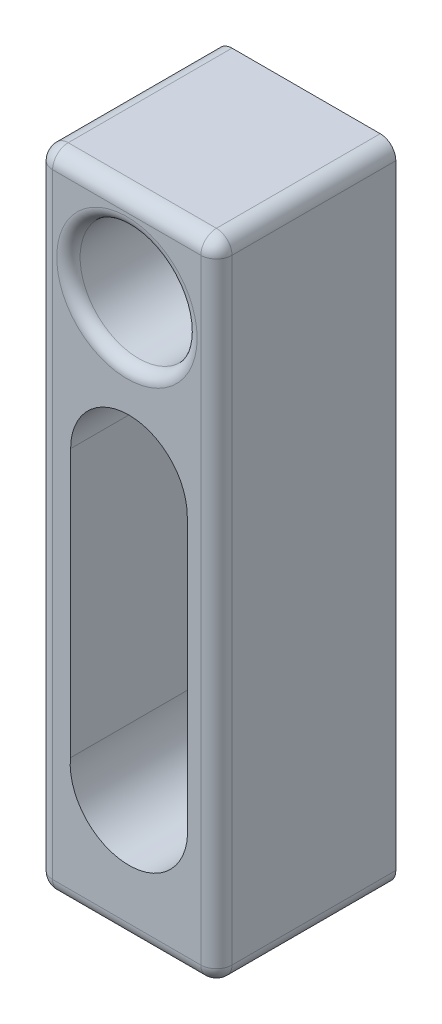
ISO-10303-21;
HEADER;
FILE_DESCRIPTION(('STEP AP214'),'2;1');
FILE_NAME('part.step','',(''),(''),'','','');
FILE_SCHEMA(('AUTOMOTIVE_DESIGN { 1 0 10303 214 1 1 1 1 }'));
ENDSEC;
DATA;
#1=APPLICATION_CONTEXT('core data for automotive mechanical design processes');
#2=APPLICATION_PROTOCOL_DEFINITION('international standard','automotive_design',2000,#1);
#3=PRODUCT_CONTEXT('',#1,'mechanical');
#4=PRODUCT('Part','Part','',(#3));
#5=PRODUCT_RELATED_PRODUCT_CATEGORY('part','',(#4));
#6=PRODUCT_DEFINITION_FORMATION('','',#4);
#7=PRODUCT_DEFINITION_CONTEXT('part definition',#1,'design');
#8=PRODUCT_DEFINITION('design','',#6,#7);
#9=PRODUCT_DEFINITION_SHAPE('','',#8);
#10=(LENGTH_UNIT() NAMED_UNIT(*) SI_UNIT(.MILLI.,.METRE.));
#11=(NAMED_UNIT(*) PLANE_ANGLE_UNIT() SI_UNIT($,.RADIAN.));
#12=(NAMED_UNIT(*) SI_UNIT($,.STERADIAN.) SOLID_ANGLE_UNIT());
#13=UNCERTAINTY_MEASURE_WITH_UNIT(LENGTH_MEASURE(1.E-05),#10,'distance_accuracy_value','');
#14=(GEOMETRIC_REPRESENTATION_CONTEXT(3) GLOBAL_UNCERTAINTY_ASSIGNED_CONTEXT((#13)) GLOBAL_UNIT_ASSIGNED_CONTEXT((#10,
#11,#12)) REPRESENTATION_CONTEXT('',''));
#15=CARTESIAN_POINT('',(0.,0.,0.));
#16=DIRECTION('',(0.,0.,1.));
#17=DIRECTION('',(1.,0.,0.));
#18=AXIS2_PLACEMENT_3D('',#15,#16,#17);
#19=CARTESIAN_POINT('',(0.,0.,2.3));
#20=DIRECTION('',(1.,0.,0.));
#21=DIRECTION('',(0.,1.,0.));
#22=AXIS2_PLACEMENT_3D('',#19,#20,#21);
#23=PLANE('',#22);
#24=DIRECTION('',(0.,-1.,0.));
#25=VECTOR('',#24,1.);
#26=CARTESIAN_POINT('',(0.,0.,0.));
#27=LINE('',#26,#25);
#28=CARTESIAN_POINT('',(0.,-0.2,0.));
#29=VERTEX_POINT('',#28);
#30=CARTESIAN_POINT('',(0.,-8.08,0.));
#31=VERTEX_POINT('',#30);
#32=EDGE_CURVE('E220',#29,#31,#27,.T.);
#33=ORIENTED_EDGE('',*,*,#32,.T.);
#34=DIRECTION('',(0.,0.,-1.));
#35=VECTOR('',#34,1.);
#36=CARTESIAN_POINT('',(0.,-8.08,2.3));
#37=LINE('',#36,#35);
#38=CARTESIAN_POINT('',(0.,-8.08,2.1));
#39=VERTEX_POINT('',#38);
#40=EDGE_CURVE('E317',#31,#39,#37,.F.);
#41=ORIENTED_EDGE('',*,*,#40,.T.);
#42=DIRECTION('',(0.,-1.,0.));
#43=VECTOR('',#42,1.);
#44=CARTESIAN_POINT('',(0.,-0.2,2.1));
#45=LINE('',#44,#43);
#46=CARTESIAN_POINT('',(0.,-0.2,2.1));
#47=VERTEX_POINT('',#46);
#48=EDGE_CURVE('E265',#39,#47,#45,.F.);
#49=ORIENTED_EDGE('',*,*,#48,.T.);
#50=DIRECTION('',(0.,0.,-1.));
#51=VECTOR('',#50,1.);
#52=CARTESIAN_POINT('',(0.,-0.2,2.3));
#53=LINE('',#52,#51);
#54=EDGE_CURVE('E276',#47,#29,#53,.T.);
#55=ORIENTED_EDGE('',*,*,#54,.T.);
#56=EDGE_LOOP('',(#33,#41,#49,#55));
#57=FACE_BOUND('',#56,.T.);
#58=ADVANCED_FACE('F41',(#57),#23,.F.);
#59=CARTESIAN_POINT('',(0.,-8.28,2.3));
#60=DIRECTION('',(0.,1.,0.));
#61=DIRECTION('',(0.,0.,1.));
#62=AXIS2_PLACEMENT_3D('',#59,#60,#61);
#63=PLANE('',#62);
#64=DIRECTION('',(1.,0.,0.));
#65=VECTOR('',#64,1.);
#66=CARTESIAN_POINT('',(0.200000000000001,-8.28,2.1));
#67=LINE('',#66,#65);
#68=CARTESIAN_POINT('',(2.1,-8.28,2.1));
#69=VERTEX_POINT('',#68);
#70=CARTESIAN_POINT('',(0.200000000000001,-8.28,2.1));
#71=VERTEX_POINT('',#70);
#72=EDGE_CURVE('E293',#69,#71,#67,.F.);
#73=ORIENTED_EDGE('',*,*,#72,.T.);
#74=DIRECTION('',(0.,0.,-1.));
#75=VECTOR('',#74,1.);
#76=CARTESIAN_POINT('',(0.200000000000001,-8.28,2.3));
#77=LINE('',#76,#75);
#78=CARTESIAN_POINT('',(0.200000000000001,-8.28,0.));
#79=VERTEX_POINT('',#78);
#80=EDGE_CURVE('E307',#71,#79,#77,.T.);
#81=ORIENTED_EDGE('',*,*,#80,.T.);
#82=DIRECTION('',(1.,0.,0.));
#83=VECTOR('',#82,1.);
#84=CARTESIAN_POINT('',(0.,-8.28,0.));
#85=LINE('',#84,#83);
#86=CARTESIAN_POINT('',(2.1,-8.28,0.));
#87=VERTEX_POINT('',#86);
#88=EDGE_CURVE('E224',#79,#87,#85,.T.);
#89=ORIENTED_EDGE('',*,*,#88,.T.);
#90=DIRECTION('',(0.,0.,-1.));
#91=VECTOR('',#90,1.);
#92=CARTESIAN_POINT('',(2.1,-8.28,2.3));
#93=LINE('',#92,#91);
#94=EDGE_CURVE('E304',#87,#69,#93,.F.);
#95=ORIENTED_EDGE('',*,*,#94,.T.);
#96=EDGE_LOOP('',(#73,#81,#89,#95));
#97=FACE_BOUND('',#96,.T.);
#98=ADVANCED_FACE('F371',(#97),#63,.F.);
#99=CARTESIAN_POINT('',(2.3,-8.28,2.3));
#100=DIRECTION('',(-1.,0.,0.));
#101=DIRECTION('',(0.,0.,1.));
#102=AXIS2_PLACEMENT_3D('',#99,#100,#101);
#103=PLANE('',#102);
#104=DIRECTION('',(0.,1.,0.));
#105=VECTOR('',#104,1.);
#106=CARTESIAN_POINT('',(2.3,-8.28,2.1));
#107=LINE('',#106,#105);
#108=CARTESIAN_POINT('',(2.3,-0.2,2.1));
#109=VERTEX_POINT('',#108);
#110=CARTESIAN_POINT('',(2.3,-8.08,2.1));
#111=VERTEX_POINT('',#110);
#112=EDGE_CURVE('E251',#109,#111,#107,.F.);
#113=ORIENTED_EDGE('',*,*,#112,.T.);
#114=DIRECTION('',(0.,0.,-1.));
#115=VECTOR('',#114,1.);
#116=CARTESIAN_POINT('',(2.3,-8.08,2.3));
#117=LINE('',#116,#115);
#118=CARTESIAN_POINT('',(2.3,-8.08,0.));
#119=VERTEX_POINT('',#118);
#120=EDGE_CURVE('E323',#111,#119,#117,.T.);
#121=ORIENTED_EDGE('',*,*,#120,.T.);
#122=DIRECTION('',(0.,1.,0.));
#123=VECTOR('',#122,1.);
#124=CARTESIAN_POINT('',(2.3,-8.28,0.));
#125=LINE('',#124,#123);
#126=CARTESIAN_POINT('',(2.3,-0.200000000000001,0.));
#127=VERTEX_POINT('',#126);
#128=EDGE_CURVE('E229',#119,#127,#125,.T.);
#129=ORIENTED_EDGE('',*,*,#128,.T.);
#130=DIRECTION('',(0.,0.,-1.));
#131=VECTOR('',#130,1.);
#132=CARTESIAN_POINT('',(2.3,-0.200000000000001,2.3));
#133=LINE('',#132,#131);
#134=EDGE_CURVE('E255',#127,#109,#133,.F.);
#135=ORIENTED_EDGE('',*,*,#134,.T.);
#136=EDGE_LOOP('',(#113,#121,#129,#135));
#137=FACE_BOUND('',#136,.T.);
#138=ADVANCED_FACE('F377',(#137),#103,.F.);
#139=CARTESIAN_POINT('',(2.3,0.,2.3));
#140=DIRECTION('',(0.,-1.,0.));
#141=DIRECTION('',(1.,0.,0.));
#142=AXIS2_PLACEMENT_3D('',#139,#140,#141);
#143=PLANE('',#142);
#144=DIRECTION('',(-1.,0.,0.));
#145=VECTOR('',#144,1.);
#146=CARTESIAN_POINT('',(2.3,0.,0.));
#147=LINE('',#146,#145);
#148=CARTESIAN_POINT('',(2.1,0.,0.));
#149=VERTEX_POINT('',#148);
#150=CARTESIAN_POINT('',(0.2,0.,0.));
#151=VERTEX_POINT('',#150);
#152=EDGE_CURVE('E232',#149,#151,#147,.T.);
#153=ORIENTED_EDGE('',*,*,#152,.T.);
#154=DIRECTION('',(0.,0.,-1.));
#155=VECTOR('',#154,1.);
#156=CARTESIAN_POINT('',(0.2,0.,2.3));
#157=LINE('',#156,#155);
#158=CARTESIAN_POINT('',(0.2,0.,2.1));
#159=VERTEX_POINT('',#158);
#160=EDGE_CURVE('E283',#151,#159,#157,.F.);
#161=ORIENTED_EDGE('',*,*,#160,.T.);
#162=DIRECTION('',(-1.,0.,0.));
#163=VECTOR('',#162,1.);
#164=CARTESIAN_POINT('',(2.3,0.,2.1));
#165=LINE('',#164,#163);
#166=CARTESIAN_POINT('',(2.1,0.,2.1));
#167=VERTEX_POINT('',#166);
#168=EDGE_CURVE('E240',#159,#167,#165,.F.);
#169=ORIENTED_EDGE('',*,*,#168,.T.);
#170=DIRECTION('',(0.,0.,-1.));
#171=VECTOR('',#170,1.);
#172=CARTESIAN_POINT('',(2.1,0.,2.3));
#173=LINE('',#172,#171);
#174=EDGE_CURVE('E243',#167,#149,#173,.T.);
#175=ORIENTED_EDGE('',*,*,#174,.T.);
#176=EDGE_LOOP('',(#153,#161,#169,#175));
#177=FACE_BOUND('',#176,.T.);
#178=ADVANCED_FACE('F450',(#177),#143,.F.);
#179=CARTESIAN_POINT('',(0.,0.,2.3));
#180=DIRECTION('',(0.,0.,1.));
#181=DIRECTION('',(1.,0.,0.));
#182=AXIS2_PLACEMENT_3D('',#179,#180,#181);
#183=PLANE('',#182);
#184=DIRECTION('',(0.,-1.,0.));
#185=VECTOR('',#184,1.);
#186=CARTESIAN_POINT('',(0.428039952860004,0.,2.3));
#187=LINE('',#186,#185);
#188=CARTESIAN_POINT('',(0.428039952860004,-3.18082942262069,2.3));
#189=VERTEX_POINT('',#188);
#190=CARTESIAN_POINT('',(0.428039952860004,-6.61474734739364,2.3));
#191=VERTEX_POINT('',#190);
#192=EDGE_CURVE('E57',#189,#191,#187,.T.);
#193=ORIENTED_EDGE('',*,*,#192,.F.);
#194=DIRECTION('',(1.,0.,0.));
#195=VECTOR('',#194,1.);
#196=CARTESIAN_POINT('',(0.,-3.18082942262069,2.3));
#197=LINE('',#196,#195);
#198=CARTESIAN_POINT('',(0.431012374465321,-3.18082942262069,2.3));
#199=VERTEX_POINT('',#198);
#200=EDGE_CURVE('E175',#189,#199,#197,.T.);
#201=ORIENTED_EDGE('',*,*,#200,.T.);
#202=CARTESIAN_POINT('',(1.17803995286,-3.18082942262069,2.3));
#203=DIRECTION('',(0.,0.,1.));
#204=DIRECTION('',(1.,0.,0.));
#205=AXIS2_PLACEMENT_3D('',#202,#203,#204);
#206=CIRCLE('',#205,0.747027578394683);
#207=CARTESIAN_POINT('',(1.92506753125469,-3.18082942262069,2.3));
#208=VERTEX_POINT('',#207);
#209=EDGE_CURVE('E179',#208,#199,#206,.T.);
#210=ORIENTED_EDGE('',*,*,#209,.F.);
#211=CARTESIAN_POINT('',(1.92803995286,-3.18082942262069,2.3));
#212=VERTEX_POINT('',#211);
#213=EDGE_CURVE('E181',#208,#212,#197,.T.);
#214=ORIENTED_EDGE('',*,*,#213,.T.);
#215=DIRECTION('',(0.,-1.,0.));
#216=VECTOR('',#215,1.);
#217=CARTESIAN_POINT('',(1.92803995286,0.,2.3));
#218=LINE('',#217,#216);
#219=CARTESIAN_POINT('',(1.92803995286,-6.61474734739364,2.3));
#220=VERTEX_POINT('',#219);
#221=EDGE_CURVE('E196',#212,#220,#218,.T.);
#222=ORIENTED_EDGE('',*,*,#221,.T.);
#223=CARTESIAN_POINT('',(1.17803995286,-6.68082942262069,2.3));
#224=DIRECTION('',(0.,0.,1.));
#225=DIRECTION('',(1.,0.,0.));
#226=AXIS2_PLACEMENT_3D('',#223,#224,#225);
#227=CIRCLE('',#226,0.752905598774716);
#228=EDGE_CURVE('E193',#191,#220,#227,.T.);
#229=ORIENTED_EDGE('',*,*,#228,.F.);
#230=EDGE_LOOP('',(#193,#201,#210,#214,#222,#229));
#231=FACE_BOUND('',#230,.T.);
#232=CARTESIAN_POINT('',(1.15296730093956,-1.14465436439737,2.3));
#233=DIRECTION('',(0.,0.,1.));
#234=DIRECTION('',(1.,0.,0.));
#235=AXIS2_PLACEMENT_3D('',#232,#233,#234);
#236=CIRCLE('',#235,0.9);
#237=CARTESIAN_POINT('',(2.05296730093956,-1.14465436439737,2.3));
#238=VERTEX_POINT('',#237);
#239=EDGE_CURVE('E350',#238,#238,#236,.F.);
#240=ORIENTED_EDGE('',*,*,#239,.T.);
#241=EDGE_LOOP('',(#240));
#242=FACE_BOUND('',#241,.T.);
#243=DIRECTION('',(0.,-1.,0.));
#244=VECTOR('',#243,1.);
#245=CARTESIAN_POINT('',(0.200000000000001,-8.28,2.3));
#246=LINE('',#245,#244);
#247=CARTESIAN_POINT('',(0.2,-0.2,2.3));
#248=VERTEX_POINT('',#247);
#249=CARTESIAN_POINT('',(0.200000000000001,-8.08,2.3));
#250=VERTEX_POINT('',#249);
#251=EDGE_CURVE('E289',#248,#250,#246,.T.);
#252=ORIENTED_EDGE('',*,*,#251,.T.);
#253=DIRECTION('',(1.,0.,0.));
#254=VECTOR('',#253,1.);
#255=CARTESIAN_POINT('',(2.1,-8.08,2.3));
#256=LINE('',#255,#254);
#257=CARTESIAN_POINT('',(2.1,-8.08,2.3));
#258=VERTEX_POINT('',#257);
#259=EDGE_CURVE('E329',#250,#258,#256,.T.);
#260=ORIENTED_EDGE('',*,*,#259,.T.);
#261=DIRECTION('',(0.,1.,0.));
#262=VECTOR('',#261,1.);
#263=CARTESIAN_POINT('',(2.1,-0.200000000000001,2.3));
#264=LINE('',#263,#262);
#265=CARTESIAN_POINT('',(2.1,-0.2,2.3));
#266=VERTEX_POINT('',#265);
#267=EDGE_CURVE('E262',#258,#266,#264,.T.);
#268=ORIENTED_EDGE('',*,*,#267,.T.);
#269=DIRECTION('',(-1.,0.,0.));
#270=VECTOR('',#269,1.);
#271=CARTESIAN_POINT('',(0.,-0.2,2.3));
#272=LINE('',#271,#270);
#273=EDGE_CURVE('E236',#266,#248,#272,.T.);
#274=ORIENTED_EDGE('',*,*,#273,.T.);
#275=EDGE_LOOP('',(#252,#260,#268,#274));
#276=FACE_BOUND('',#275,.T.);
#277=ADVANCED_FACE('F465',(#231,#242,#276),#183,.T.);
#278=CARTESIAN_POINT('',(0.,0.,0.));
#279=DIRECTION('',(0.,0.,1.));
#280=DIRECTION('',(1.,0.,0.));
#281=AXIS2_PLACEMENT_3D('',#278,#279,#280);
#282=PLANE('',#281);
#283=DIRECTION('',(1.,0.,0.));
#284=VECTOR('',#283,1.);
#285=CARTESIAN_POINT('',(0.,-3.18082942262069,0.));
#286=LINE('',#285,#284);
#287=CARTESIAN_POINT('',(0.428039952860004,-3.18082942262069,0.));
#288=VERTEX_POINT('',#287);
#289=CARTESIAN_POINT('',(0.431012374465321,-3.18082942262069,0.));
#290=VERTEX_POINT('',#289);
#291=EDGE_CURVE('E161',#288,#290,#286,.T.);
#292=ORIENTED_EDGE('',*,*,#291,.F.);
#293=DIRECTION('',(0.,-1.,0.));
#294=VECTOR('',#293,1.);
#295=CARTESIAN_POINT('',(0.428039952860004,0.,0.));
#296=LINE('',#295,#294);
#297=CARTESIAN_POINT('',(0.428039952860004,-6.61474734739364,0.));
#298=VERTEX_POINT('',#297);
#299=EDGE_CURVE('E157',#288,#298,#296,.T.);
#300=ORIENTED_EDGE('',*,*,#299,.T.);
#301=CARTESIAN_POINT('',(1.17803995286,-6.68082942262069,0.));
#302=DIRECTION('',(0.,0.,1.));
#303=DIRECTION('',(1.,0.,0.));
#304=AXIS2_PLACEMENT_3D('',#301,#302,#303);
#305=CIRCLE('',#304,0.752905598774716);
#306=CARTESIAN_POINT('',(1.92803995286,-6.61474734739364,0.));
#307=VERTEX_POINT('',#306);
#308=EDGE_CURVE('E164',#298,#307,#305,.T.);
#309=ORIENTED_EDGE('',*,*,#308,.T.);
#310=DIRECTION('',(0.,-1.,0.));
#311=VECTOR('',#310,1.);
#312=CARTESIAN_POINT('',(1.92803995286,0.,0.));
#313=LINE('',#312,#311);
#314=CARTESIAN_POINT('',(1.92803995286,-3.18082942262069,0.));
#315=VERTEX_POINT('',#314);
#316=EDGE_CURVE('E169',#315,#307,#313,.T.);
#317=ORIENTED_EDGE('',*,*,#316,.F.);
#318=CARTESIAN_POINT('',(1.92506753125469,-3.18082942262069,0.));
#319=VERTEX_POINT('',#318);
#320=EDGE_CURVE('E185',#319,#315,#286,.T.);
#321=ORIENTED_EDGE('',*,*,#320,.F.);
#322=CARTESIAN_POINT('',(1.17803995286,-3.18082942262069,0.));
#323=DIRECTION('',(0.,0.,1.));
#324=DIRECTION('',(1.,0.,0.));
#325=AXIS2_PLACEMENT_3D('',#322,#323,#324);
#326=CIRCLE('',#325,0.747027578394683);
#327=EDGE_CURVE('E188',#319,#290,#326,.T.);
#328=ORIENTED_EDGE('',*,*,#327,.T.);
#329=EDGE_LOOP('',(#292,#300,#309,#317,#321,#328));
#330=FACE_BOUND('',#329,.T.);
#331=CARTESIAN_POINT('',(1.15296730093956,-1.14465436439737,0.));
#332=DIRECTION('',(0.,0.,1.));
#333=DIRECTION('',(1.,0.,0.));
#334=AXIS2_PLACEMENT_3D('',#331,#332,#333);
#335=CIRCLE('',#334,0.9);
#336=CARTESIAN_POINT('',(2.05296730093956,-1.14465436439737,0.));
#337=VERTEX_POINT('',#336);
#338=EDGE_CURVE('E50',#337,#337,#335,.T.);
#339=ORIENTED_EDGE('',*,*,#338,.T.);
#340=EDGE_LOOP('',(#339));
#341=FACE_BOUND('',#340,.T.);
#342=ORIENTED_EDGE('',*,*,#88,.F.);
#343=CARTESIAN_POINT('',(0.200000000000001,-8.08,0.));
#344=DIRECTION('',(0.,0.,1.));
#345=DIRECTION('',(1.,0.,0.));
#346=AXIS2_PLACEMENT_3D('',#343,#344,#345);
#347=CIRCLE('',#346,0.2);
#348=EDGE_CURVE('E314',#79,#31,#347,.F.);
#349=ORIENTED_EDGE('',*,*,#348,.T.);
#350=ORIENTED_EDGE('',*,*,#32,.F.);
#351=CARTESIAN_POINT('',(0.2,-0.2,0.));
#352=DIRECTION('',(0.,0.,1.));
#353=DIRECTION('',(1.,0.,0.));
#354=AXIS2_PLACEMENT_3D('',#351,#352,#353);
#355=CIRCLE('',#354,0.2);
#356=EDGE_CURVE('E280',#29,#151,#355,.F.);
#357=ORIENTED_EDGE('',*,*,#356,.T.);
#358=ORIENTED_EDGE('',*,*,#152,.F.);
#359=CARTESIAN_POINT('',(2.1,-0.2,0.));
#360=DIRECTION('',(0.,0.,1.));
#361=DIRECTION('',(1.,0.,0.));
#362=AXIS2_PLACEMENT_3D('',#359,#360,#361);
#363=CIRCLE('',#362,0.2);
#364=EDGE_CURVE('E247',#149,#127,#363,.F.);
#365=ORIENTED_EDGE('',*,*,#364,.T.);
#366=ORIENTED_EDGE('',*,*,#128,.F.);
#367=CARTESIAN_POINT('',(2.1,-8.08,0.));
#368=DIRECTION('',(0.,0.,1.));
#369=DIRECTION('',(1.,0.,0.));
#370=AXIS2_PLACEMENT_3D('',#367,#368,#369);
#371=CIRCLE('',#370,0.2);
#372=EDGE_CURVE('E311',#119,#87,#371,.F.);
#373=ORIENTED_EDGE('',*,*,#372,.T.);
#374=EDGE_LOOP('',(#342,#349,#350,#357,#358,#365,#366,#373));
#375=FACE_BOUND('',#374,.T.);
#376=ADVANCED_FACE('F171',(#330,#341,#375),#282,.F.);
#377=CARTESIAN_POINT('',(1.15296730093956,-1.14465436439737,-0.327407371106172));
#378=DIRECTION('',(0.,0.,1.));
#379=DIRECTION('',(1.,0.,0.));
#380=AXIS2_PLACEMENT_3D('',#377,#378,#379);
#381=CYLINDRICAL_SURFACE('',#380,0.75);
#382=CARTESIAN_POINT('',(1.15296730093956,-1.14465436439737,0.15));
#383=DIRECTION('',(0.,0.,1.));
#384=DIRECTION('',(1.,0.,0.));
#385=AXIS2_PLACEMENT_3D('',#382,#383,#384);
#386=CIRCLE('',#385,0.75);
#387=CARTESIAN_POINT('',(1.90296730093956,-1.14465436439737,0.15));
#388=VERTEX_POINT('',#387);
#389=EDGE_CURVE('E11',#388,#388,#386,.F.);
#390=ORIENTED_EDGE('',*,*,#389,.T.);
#391=EDGE_LOOP('',(#390));
#392=FACE_BOUND('',#391,.T.);
#393=CARTESIAN_POINT('',(1.15296730093956,-1.14465436439737,2.15));
#394=DIRECTION('',(0.,0.,1.));
#395=DIRECTION('',(1.,0.,0.));
#396=AXIS2_PLACEMENT_3D('',#393,#394,#395);
#397=CIRCLE('',#396,0.75);
#398=CARTESIAN_POINT('',(1.90296730093956,-1.14465436439737,2.15));
#399=VERTEX_POINT('',#398);
#400=EDGE_CURVE('E332',#399,#399,#397,.T.);
#401=ORIENTED_EDGE('',*,*,#400,.T.);
#402=EDGE_LOOP('',(#401));
#403=FACE_BOUND('',#402,.T.);
#404=ADVANCED_FACE('F386',(#392,#403),#381,.F.);
#405=CARTESIAN_POINT('',(0.,-0.2,2.1));
#406=DIRECTION('',(1.,0.,0.));
#407=DIRECTION('',(0.,1.,0.));
#408=AXIS2_PLACEMENT_3D('',#405,#406,#407);
#409=CYLINDRICAL_SURFACE('',#408,0.2);
#410=ORIENTED_EDGE('',*,*,#168,.F.);
#411=CARTESIAN_POINT('',(0.2,-0.2,2.1));
#412=DIRECTION('',(1.,0.,0.));
#413=DIRECTION('',(0.,1.,0.));
#414=AXIS2_PLACEMENT_3D('',#411,#412,#413);
#415=CIRCLE('',#414,0.2);
#416=EDGE_CURVE('E286',#159,#248,#415,.T.);
#417=ORIENTED_EDGE('',*,*,#416,.T.);
#418=ORIENTED_EDGE('',*,*,#273,.F.);
#419=CARTESIAN_POINT('',(2.1,-0.2,2.1));
#420=DIRECTION('',(1.,0.,0.));
#421=DIRECTION('',(0.,1.,0.));
#422=AXIS2_PLACEMENT_3D('',#419,#420,#421);
#423=CIRCLE('',#422,0.2);
#424=EDGE_CURVE('E258',#266,#167,#423,.F.);
#425=ORIENTED_EDGE('',*,*,#424,.T.);
#426=EDGE_LOOP('',(#410,#417,#418,#425));
#427=FACE_BOUND('',#426,.T.);
#428=ADVANCED_FACE('F382',(#427),#409,.T.);
#429=CARTESIAN_POINT('',(2.1,0.,2.1));
#430=DIRECTION('',(0.,-1.,0.));
#431=DIRECTION('',(0.,0.,-1.));
#432=AXIS2_PLACEMENT_3D('',#429,#430,#431);
#433=CYLINDRICAL_SURFACE('',#432,0.2);
#434=ORIENTED_EDGE('',*,*,#267,.F.);
#435=CARTESIAN_POINT('',(2.1,-8.08,2.1));
#436=DIRECTION('',(0.,-1.,0.));
#437=DIRECTION('',(0.,0.,-1.));
#438=AXIS2_PLACEMENT_3D('',#435,#436,#437);
#439=CIRCLE('',#438,0.2);
#440=EDGE_CURVE('E326',#258,#111,#439,.F.);
#441=ORIENTED_EDGE('',*,*,#440,.T.);
#442=ORIENTED_EDGE('',*,*,#112,.F.);
#443=CARTESIAN_POINT('',(2.1,-0.2,2.1));
#444=DIRECTION('',(0.,1.,0.));
#445=DIRECTION('',(0.,0.,1.));
#446=AXIS2_PLACEMENT_3D('',#443,#444,#445);
#447=CIRCLE('',#446,0.2);
#448=EDGE_CURVE('E225',#266,#109,#447,.T.);
#449=ORIENTED_EDGE('',*,*,#448,.F.);
#450=EDGE_LOOP('',(#434,#441,#442,#449));
#451=FACE_BOUND('',#450,.T.);
#452=ADVANCED_FACE('F385',(#451),#433,.T.);
#453=CARTESIAN_POINT('',(2.1,-0.2,2.1));
#454=DIRECTION('',(-1.,0.,0.));
#455=DIRECTION('',(0.,0.,1.));
#456=AXIS2_PLACEMENT_3D('',#453,#454,#455);
#457=SPHERICAL_SURFACE('',#456,0.2);
#458=ORIENTED_EDGE('',*,*,#424,.F.);
#459=ORIENTED_EDGE('',*,*,#448,.T.);
#460=CARTESIAN_POINT('',(2.1,-0.2,2.1));
#461=DIRECTION('',(0.,0.,-1.));
#462=DIRECTION('',(-1.,0.,0.));
#463=AXIS2_PLACEMENT_3D('',#460,#461,#462);
#464=CIRCLE('',#463,0.2);
#465=EDGE_CURVE('E266',#167,#109,#464,.T.);
#466=ORIENTED_EDGE('',*,*,#465,.F.);
#467=EDGE_LOOP('',(#458,#459,#466));
#468=FACE_BOUND('',#467,.T.);
#469=ADVANCED_FACE('F392',(#468),#457,.T.);
#470=CARTESIAN_POINT('',(2.1,-0.2,2.3));
#471=DIRECTION('',(0.,0.,-1.));
#472=DIRECTION('',(-1.,0.,0.));
#473=AXIS2_PLACEMENT_3D('',#470,#471,#472);
#474=CYLINDRICAL_SURFACE('',#473,0.2);
#475=ORIENTED_EDGE('',*,*,#465,.T.);
#476=ORIENTED_EDGE('',*,*,#134,.F.);
#477=ORIENTED_EDGE('',*,*,#364,.F.);
#478=ORIENTED_EDGE('',*,*,#174,.F.);
#479=EDGE_LOOP('',(#475,#476,#477,#478));
#480=FACE_BOUND('',#479,.T.);
#481=ADVANCED_FACE('F388',(#480),#474,.T.);
#482=CARTESIAN_POINT('',(0.2,0.,2.1));
#483=DIRECTION('',(0.,1.,0.));
#484=DIRECTION('',(-1.,0.,0.));
#485=AXIS2_PLACEMENT_3D('',#482,#483,#484);
#486=CYLINDRICAL_SURFACE('',#485,0.2);
#487=ORIENTED_EDGE('',*,*,#48,.F.);
#488=CARTESIAN_POINT('',(0.200000000000001,-8.08,2.1));
#489=DIRECTION('',(0.,1.,0.));
#490=DIRECTION('',(-1.,0.,0.));
#491=AXIS2_PLACEMENT_3D('',#488,#489,#490);
#492=CIRCLE('',#491,0.2);
#493=EDGE_CURVE('E320',#39,#250,#492,.T.);
#494=ORIENTED_EDGE('',*,*,#493,.T.);
#495=ORIENTED_EDGE('',*,*,#251,.F.);
#496=CARTESIAN_POINT('',(0.2,-0.2,2.1));
#497=DIRECTION('',(0.,1.,0.));
#498=DIRECTION('',(-1.,0.,0.));
#499=AXIS2_PLACEMENT_3D('',#496,#497,#498);
#500=CIRCLE('',#499,0.2);
#501=EDGE_CURVE('E270',#47,#248,#500,.T.);
#502=ORIENTED_EDGE('',*,*,#501,.F.);
#503=EDGE_LOOP('',(#487,#494,#495,#502));
#504=FACE_BOUND('',#503,.T.);
#505=ADVANCED_FACE('F391',(#504),#486,.T.);
#506=CARTESIAN_POINT('',(0.2,-0.2,2.1));
#507=DIRECTION('',(1.,0.,0.));
#508=DIRECTION('',(0.,1.,0.));
#509=AXIS2_PLACEMENT_3D('',#506,#507,#508);
#510=SPHERICAL_SURFACE('',#509,0.2);
#511=ORIENTED_EDGE('',*,*,#501,.T.);
#512=ORIENTED_EDGE('',*,*,#416,.F.);
#513=CARTESIAN_POINT('',(0.2,-0.2,2.1));
#514=DIRECTION('',(0.,0.,-1.));
#515=DIRECTION('',(-1.,0.,0.));
#516=AXIS2_PLACEMENT_3D('',#513,#514,#515);
#517=CIRCLE('',#516,0.2);
#518=EDGE_CURVE('E294',#47,#159,#517,.T.);
#519=ORIENTED_EDGE('',*,*,#518,.F.);
#520=EDGE_LOOP('',(#511,#512,#519));
#521=FACE_BOUND('',#520,.T.);
#522=ADVANCED_FACE('F404',(#521),#510,.T.);
#523=CARTESIAN_POINT('',(0.2,-0.2,2.3));
#524=DIRECTION('',(0.,0.,-1.));
#525=DIRECTION('',(-1.,0.,0.));
#526=AXIS2_PLACEMENT_3D('',#523,#524,#525);
#527=CYLINDRICAL_SURFACE('',#526,0.2);
#528=ORIENTED_EDGE('',*,*,#518,.T.);
#529=ORIENTED_EDGE('',*,*,#160,.F.);
#530=ORIENTED_EDGE('',*,*,#356,.F.);
#531=ORIENTED_EDGE('',*,*,#54,.F.);
#532=EDGE_LOOP('',(#528,#529,#530,#531));
#533=FACE_BOUND('',#532,.T.);
#534=ADVANCED_FACE('F400',(#533),#527,.T.);
#535=CARTESIAN_POINT('',(2.1,-8.08,2.3));
#536=DIRECTION('',(0.,0.,-1.));
#537=DIRECTION('',(-1.,0.,0.));
#538=AXIS2_PLACEMENT_3D('',#535,#536,#537);
#539=CYLINDRICAL_SURFACE('',#538,0.2);
#540=ORIENTED_EDGE('',*,*,#372,.F.);
#541=ORIENTED_EDGE('',*,*,#120,.F.);
#542=CARTESIAN_POINT('',(2.1,-8.08,2.1));
#543=DIRECTION('',(0.,0.,1.));
#544=DIRECTION('',(1.,0.,0.));
#545=AXIS2_PLACEMENT_3D('',#542,#543,#544);
#546=CIRCLE('',#545,0.2);
#547=EDGE_CURVE('E298',#69,#111,#546,.T.);
#548=ORIENTED_EDGE('',*,*,#547,.F.);
#549=ORIENTED_EDGE('',*,*,#94,.F.);
#550=EDGE_LOOP('',(#540,#541,#548,#549));
#551=FACE_BOUND('',#550,.T.);
#552=ADVANCED_FACE('F403',(#551),#539,.T.);
#553=CARTESIAN_POINT('',(2.1,-8.08,2.1));
#554=DIRECTION('',(0.,1.,0.));
#555=DIRECTION('',(0.,0.,1.));
#556=AXIS2_PLACEMENT_3D('',#553,#554,#555);
#557=SPHERICAL_SURFACE('',#556,0.2);
#558=ORIENTED_EDGE('',*,*,#547,.T.);
#559=ORIENTED_EDGE('',*,*,#440,.F.);
#560=CARTESIAN_POINT('',(2.1,-8.08,2.1));
#561=DIRECTION('',(-1.,0.,0.));
#562=DIRECTION('',(0.,0.,1.));
#563=AXIS2_PLACEMENT_3D('',#560,#561,#562);
#564=CIRCLE('',#563,0.2);
#565=EDGE_CURVE('E340',#69,#258,#564,.T.);
#566=ORIENTED_EDGE('',*,*,#565,.F.);
#567=EDGE_LOOP('',(#558,#559,#566));
#568=FACE_BOUND('',#567,.T.);
#569=ADVANCED_FACE('F422',(#568),#557,.T.);
#570=CARTESIAN_POINT('',(0.,-8.08,2.1));
#571=DIRECTION('',(-1.,0.,0.));
#572=DIRECTION('',(0.,0.,1.));
#573=AXIS2_PLACEMENT_3D('',#570,#571,#572);
#574=CYLINDRICAL_SURFACE('',#573,0.2);
#575=ORIENTED_EDGE('',*,*,#565,.T.);
#576=ORIENTED_EDGE('',*,*,#259,.F.);
#577=CARTESIAN_POINT('',(0.200000000000001,-8.08,2.1));
#578=DIRECTION('',(-1.,0.,0.));
#579=DIRECTION('',(0.,0.,1.));
#580=AXIS2_PLACEMENT_3D('',#577,#578,#579);
#581=CIRCLE('',#580,0.2);
#582=EDGE_CURVE('E336',#71,#250,#581,.T.);
#583=ORIENTED_EDGE('',*,*,#582,.F.);
#584=ORIENTED_EDGE('',*,*,#72,.F.);
#585=EDGE_LOOP('',(#575,#576,#583,#584));
#586=FACE_BOUND('',#585,.T.);
#587=ADVANCED_FACE('F418',(#586),#574,.T.);
#588=CARTESIAN_POINT('',(0.200000000000001,-8.08,2.1));
#589=DIRECTION('',(0.,1.,0.));
#590=DIRECTION('',(0.,0.,1.));
#591=AXIS2_PLACEMENT_3D('',#588,#589,#590);
#592=SPHERICAL_SURFACE('',#591,0.2);
#593=ORIENTED_EDGE('',*,*,#582,.T.);
#594=ORIENTED_EDGE('',*,*,#493,.F.);
#595=CARTESIAN_POINT('',(0.200000000000001,-8.08,2.1));
#596=DIRECTION('',(0.,0.,-1.));
#597=DIRECTION('',(-1.,0.,0.));
#598=AXIS2_PLACEMENT_3D('',#595,#596,#597);
#599=CIRCLE('',#598,0.2);
#600=EDGE_CURVE('E208',#71,#39,#599,.T.);
#601=ORIENTED_EDGE('',*,*,#600,.F.);
#602=EDGE_LOOP('',(#593,#594,#601));
#603=FACE_BOUND('',#602,.T.);
#604=ADVANCED_FACE('F414',(#603),#592,.T.);
#605=CARTESIAN_POINT('',(0.200000000000001,-8.08,2.3));
#606=DIRECTION('',(0.,0.,-1.));
#607=DIRECTION('',(-1.,0.,0.));
#608=AXIS2_PLACEMENT_3D('',#605,#606,#607);
#609=CYLINDRICAL_SURFACE('',#608,0.2);
#610=ORIENTED_EDGE('',*,*,#600,.T.);
#611=ORIENTED_EDGE('',*,*,#40,.F.);
#612=ORIENTED_EDGE('',*,*,#348,.F.);
#613=ORIENTED_EDGE('',*,*,#80,.F.);
#614=EDGE_LOOP('',(#610,#611,#612,#613));
#615=FACE_BOUND('',#614,.T.);
#616=ADVANCED_FACE('F367',(#615),#609,.T.);
#617=CARTESIAN_POINT('',(1.15296730093956,-1.14465436439737,2.15));
#618=DIRECTION('',(0.,0.,1.));
#619=DIRECTION('',(1.,0.,0.));
#620=AXIS2_PLACEMENT_3D('',#617,#618,#619);
#621=TOROIDAL_SURFACE('',#620,0.9,0.15);
#622=ORIENTED_EDGE('',*,*,#239,.F.);
#623=EDGE_LOOP('',(#622));
#624=FACE_BOUND('',#623,.T.);
#625=ORIENTED_EDGE('',*,*,#400,.F.);
#626=EDGE_LOOP('',(#625));
#627=FACE_BOUND('',#626,.T.);
#628=ADVANCED_FACE('F359',(#624,#627),#621,.T.);
#629=CARTESIAN_POINT('',(1.15296730093956,-1.14465436439737,0.15));
#630=DIRECTION('',(0.,0.,1.));
#631=DIRECTION('',(1.,0.,0.));
#632=AXIS2_PLACEMENT_3D('',#629,#630,#631);
#633=TOROIDAL_SURFACE('',#632,0.9,0.15);
#634=ORIENTED_EDGE('',*,*,#389,.F.);
#635=EDGE_LOOP('',(#634));
#636=FACE_BOUND('',#635,.T.);
#637=ORIENTED_EDGE('',*,*,#338,.F.);
#638=EDGE_LOOP('',(#637));
#639=FACE_BOUND('',#638,.T.);
#640=ADVANCED_FACE('F43',(#636,#639),#633,.T.);
#641=CARTESIAN_POINT('',(0.428039952860004,0.,0.));
#642=DIRECTION('',(-1.,0.,0.));
#643=DIRECTION('',(0.,-1.,0.));
#644=AXIS2_PLACEMENT_3D('',#641,#642,#643);
#645=PLANE('',#644);
#646=ORIENTED_EDGE('',*,*,#192,.T.);
#647=DIRECTION('',(0.,0.,1.));
#648=VECTOR('',#647,1.);
#649=CARTESIAN_POINT('',(0.428039952860004,-6.61474734739364,0.));
#650=LINE('',#649,#648);
#651=EDGE_CURVE('E154',#298,#191,#650,.T.);
#652=ORIENTED_EDGE('',*,*,#651,.F.);
#653=ORIENTED_EDGE('',*,*,#299,.F.);
#654=DIRECTION('',(0.,0.,1.));
#655=VECTOR('',#654,1.);
#656=CARTESIAN_POINT('',(0.428039952860004,-3.18082942262069,0.));
#657=LINE('',#656,#655);
#658=EDGE_CURVE('E205',#288,#189,#657,.T.);
#659=ORIENTED_EDGE('',*,*,#658,.T.);
#660=EDGE_LOOP('',(#646,#652,#653,#659));
#661=FACE_BOUND('',#660,.T.);
#662=ADVANCED_FACE('F155',(#661),#645,.F.);
#663=CARTESIAN_POINT('',(0.,-3.18082942262069,0.));
#664=DIRECTION('',(0.,-1.,0.));
#665=DIRECTION('',(0.,0.,-1.));
#666=AXIS2_PLACEMENT_3D('',#663,#664,#665);
#667=PLANE('',#666);
#668=ORIENTED_EDGE('',*,*,#200,.F.);
#669=ORIENTED_EDGE('',*,*,#658,.F.);
#670=ORIENTED_EDGE('',*,*,#291,.T.);
#671=DIRECTION('',(0.,0.,1.));
#672=VECTOR('',#671,1.);
#673=CARTESIAN_POINT('',(0.431012374465321,-3.18082942262069,0.));
#674=LINE('',#673,#672);
#675=EDGE_CURVE('E209',#290,#199,#674,.T.);
#676=ORIENTED_EDGE('',*,*,#675,.T.);
#677=EDGE_LOOP('',(#668,#669,#670,#676));
#678=FACE_BOUND('',#677,.T.);
#679=ADVANCED_FACE('F365',(#678),#667,.T.);
#680=CARTESIAN_POINT('',(1.17803995286,-3.18082942262069,0.));
#681=DIRECTION('',(0.,0.,1.));
#682=DIRECTION('',(1.,0.,0.));
#683=AXIS2_PLACEMENT_3D('',#680,#681,#682);
#684=CYLINDRICAL_SURFACE('',#683,0.747027578394683);
#685=ORIENTED_EDGE('',*,*,#209,.T.);
#686=ORIENTED_EDGE('',*,*,#675,.F.);
#687=ORIENTED_EDGE('',*,*,#327,.F.);
#688=DIRECTION('',(0.,0.,1.));
#689=VECTOR('',#688,1.);
#690=CARTESIAN_POINT('',(1.92506753125469,-3.18082942262069,0.));
#691=LINE('',#690,#689);
#692=EDGE_CURVE('E212',#319,#208,#691,.T.);
#693=ORIENTED_EDGE('',*,*,#692,.T.);
#694=EDGE_LOOP('',(#685,#686,#687,#693));
#695=FACE_BOUND('',#694,.T.);
#696=ADVANCED_FACE('F583',(#695),#684,.F.);
#697=ORIENTED_EDGE('',*,*,#213,.F.);
#698=ORIENTED_EDGE('',*,*,#692,.F.);
#699=ORIENTED_EDGE('',*,*,#320,.T.);
#700=DIRECTION('',(0.,0.,1.));
#701=VECTOR('',#700,1.);
#702=CARTESIAN_POINT('',(1.92803995286,-3.18082942262069,0.));
#703=LINE('',#702,#701);
#704=EDGE_CURVE('E215',#315,#212,#703,.T.);
#705=ORIENTED_EDGE('',*,*,#704,.T.);
#706=EDGE_LOOP('',(#697,#698,#699,#705));
#707=FACE_BOUND('',#706,.T.);
#708=ADVANCED_FACE('F586',(#707),#667,.T.);
#709=CARTESIAN_POINT('',(1.92803995286,0.,0.));
#710=DIRECTION('',(-1.,0.,0.));
#711=DIRECTION('',(0.,0.,1.));
#712=AXIS2_PLACEMENT_3D('',#709,#710,#711);
#713=PLANE('',#712);
#714=ORIENTED_EDGE('',*,*,#221,.F.);
#715=ORIENTED_EDGE('',*,*,#704,.F.);
#716=ORIENTED_EDGE('',*,*,#316,.T.);
#717=DIRECTION('',(0.,0.,1.));
#718=VECTOR('',#717,1.);
#719=CARTESIAN_POINT('',(1.92803995286,-6.61474734739364,0.));
#720=LINE('',#719,#718);
#721=EDGE_CURVE('E65',#307,#220,#720,.T.);
#722=ORIENTED_EDGE('',*,*,#721,.T.);
#723=EDGE_LOOP('',(#714,#715,#716,#722));
#724=FACE_BOUND('',#723,.T.);
#725=ADVANCED_FACE('F601',(#724),#713,.T.);
#726=CARTESIAN_POINT('',(1.17803995286,-6.68082942262069,0.));
#727=DIRECTION('',(0.,0.,1.));
#728=DIRECTION('',(1.,0.,0.));
#729=AXIS2_PLACEMENT_3D('',#726,#727,#728);
#730=CYLINDRICAL_SURFACE('',#729,0.752905598774716);
#731=ORIENTED_EDGE('',*,*,#228,.T.);
#732=ORIENTED_EDGE('',*,*,#721,.F.);
#733=ORIENTED_EDGE('',*,*,#308,.F.);
#734=ORIENTED_EDGE('',*,*,#651,.T.);
#735=EDGE_LOOP('',(#731,#732,#733,#734));
#736=FACE_BOUND('',#735,.T.);
#737=ADVANCED_FACE('F165',(#736),#730,.F.);
#738=CLOSED_SHELL('',(#58,#98,#138,#178,#277,#376,#404,#428,#452,#469,#481,#505,#522,#534,#552,
#569,#587,#604,#616,#628,#640,#662,#679,#696,#708,#725,#737));
#739=MANIFOLD_SOLID_BREP('B2',#738);
#740=ADVANCED_BREP_SHAPE_REPRESENTATION('',(#18,#739),#14);
#741=SHAPE_DEFINITION_REPRESENTATION(#9,#740);
ENDSEC;
END-ISO-10303-21;
